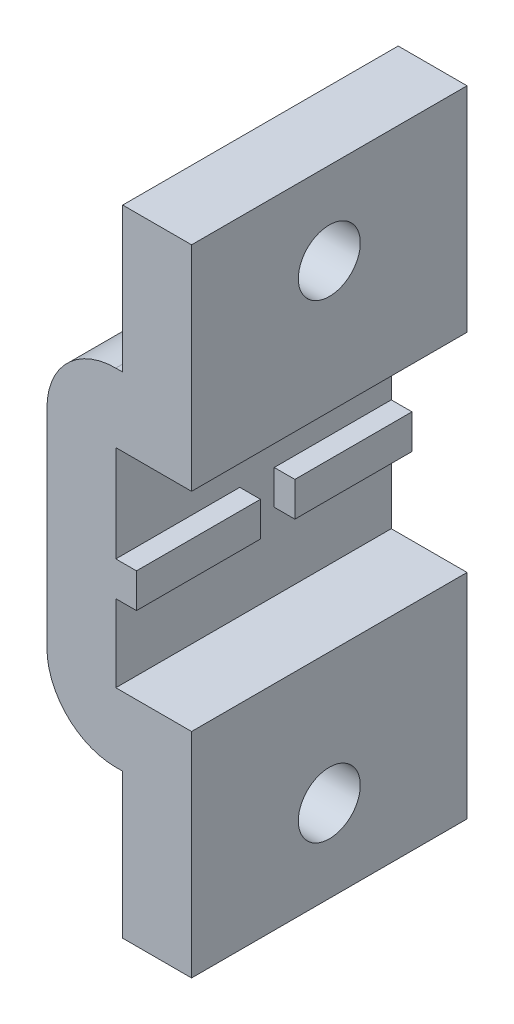
ISO-10303-21;
HEADER;
FILE_DESCRIPTION(('STEP AP214'),'2;1');
FILE_NAME('part.step','',(''),(''),'','','');
FILE_SCHEMA(('AUTOMOTIVE_DESIGN { 1 0 10303 214 1 1 1 1 }'));
ENDSEC;
DATA;
#1=APPLICATION_CONTEXT('core data for automotive mechanical design processes');
#2=APPLICATION_PROTOCOL_DEFINITION('international standard','automotive_design',2000,#1);
#3=PRODUCT_CONTEXT('',#1,'mechanical');
#4=PRODUCT('Part','Part','',(#3));
#5=PRODUCT_RELATED_PRODUCT_CATEGORY('part','',(#4));
#6=PRODUCT_DEFINITION_FORMATION('','',#4);
#7=PRODUCT_DEFINITION_CONTEXT('part definition',#1,'design');
#8=PRODUCT_DEFINITION('design','',#6,#7);
#9=PRODUCT_DEFINITION_SHAPE('','',#8);
#10=(LENGTH_UNIT() NAMED_UNIT(*) SI_UNIT(.MILLI.,.METRE.));
#11=(NAMED_UNIT(*) PLANE_ANGLE_UNIT() SI_UNIT($,.RADIAN.));
#12=(NAMED_UNIT(*) SI_UNIT($,.STERADIAN.) SOLID_ANGLE_UNIT());
#13=UNCERTAINTY_MEASURE_WITH_UNIT(LENGTH_MEASURE(1.E-05),#10,'distance_accuracy_value','');
#14=(GEOMETRIC_REPRESENTATION_CONTEXT(3) GLOBAL_UNCERTAINTY_ASSIGNED_CONTEXT((#13)) GLOBAL_UNIT_ASSIGNED_CONTEXT((#10,
#11,#12)) REPRESENTATION_CONTEXT('',''));
#15=CARTESIAN_POINT('',(0.,0.,0.));
#16=DIRECTION('',(0.,0.,1.));
#17=DIRECTION('',(1.,0.,0.));
#18=AXIS2_PLACEMENT_3D('',#15,#16,#17);
#19=CARTESIAN_POINT('',(-5.5,0.,20.));
#20=DIRECTION('',(-1.,0.,0.));
#21=DIRECTION('',(0.,0.,1.));
#22=AXIS2_PLACEMENT_3D('',#19,#20,#21);
#23=PLANE('',#22);
#24=DIRECTION('',(0.,0.,-1.));
#25=VECTOR('',#24,1.);
#26=CARTESIAN_POINT('',(-5.5,5.6,20.));
#27=LINE('',#26,#25);
#28=CARTESIAN_POINT('',(-5.5,5.6,20.));
#29=VERTEX_POINT('',#28);
#30=CARTESIAN_POINT('',(-5.5,5.6,11.));
#31=VERTEX_POINT('',#30);
#32=EDGE_CURVE('E257',#29,#31,#27,.T.);
#33=ORIENTED_EDGE('',*,*,#32,.F.);
#34=DIRECTION('',(0.,1.,0.));
#35=VECTOR('',#34,1.);
#36=CARTESIAN_POINT('',(-5.5,0.,20.));
#37=LINE('',#36,#35);
#38=CARTESIAN_POINT('',(-5.5,0.,20.));
#39=VERTEX_POINT('',#38);
#40=EDGE_CURVE('E219',#39,#29,#37,.T.);
#41=ORIENTED_EDGE('',*,*,#40,.F.);
#42=DIRECTION('',(0.,0.,-1.));
#43=VECTOR('',#42,1.);
#44=CARTESIAN_POINT('',(-5.5,0.,20.));
#45=LINE('',#44,#43);
#46=CARTESIAN_POINT('',(-5.5,0.,0.));
#47=VERTEX_POINT('',#46);
#48=EDGE_CURVE('E370',#39,#47,#45,.T.);
#49=ORIENTED_EDGE('',*,*,#48,.T.);
#50=DIRECTION('',(0.,1.,0.));
#51=VECTOR('',#50,1.);
#52=CARTESIAN_POINT('',(-5.5,0.,0.));
#53=LINE('',#52,#51);
#54=CARTESIAN_POINT('',(-5.5,5.6,0.));
#55=VERTEX_POINT('',#54);
#56=EDGE_CURVE('E351',#47,#55,#53,.T.);
#57=ORIENTED_EDGE('',*,*,#56,.T.);
#58=DIRECTION('',(0.,0.,-1.));
#59=VECTOR('',#58,1.);
#60=CARTESIAN_POINT('',(-5.5,5.6,0.));
#61=LINE('',#60,#59);
#62=CARTESIAN_POINT('',(-5.5,5.6,8.5));
#63=VERTEX_POINT('',#62);
#64=EDGE_CURVE('E66',#63,#55,#61,.T.);
#65=ORIENTED_EDGE('',*,*,#64,.F.);
#66=DIRECTION('',(0.,-1.,0.));
#67=VECTOR('',#66,1.);
#68=CARTESIAN_POINT('',(-5.5,5.6,8.5));
#69=LINE('',#68,#67);
#70=CARTESIAN_POINT('',(-5.5,8.1,8.5));
#71=VERTEX_POINT('',#70);
#72=EDGE_CURVE('E61',#71,#63,#69,.T.);
#73=ORIENTED_EDGE('',*,*,#72,.F.);
#74=DIRECTION('',(0.,0.,1.));
#75=VECTOR('',#74,1.);
#76=CARTESIAN_POINT('',(-5.5,8.1,0.));
#77=LINE('',#76,#75);
#78=CARTESIAN_POINT('',(-5.5,8.1,0.));
#79=VERTEX_POINT('',#78);
#80=EDGE_CURVE('E254',#79,#71,#77,.T.);
#81=ORIENTED_EDGE('',*,*,#80,.F.);
#82=CARTESIAN_POINT('',(-5.5,15.1,0.));
#83=VERTEX_POINT('',#82);
#84=EDGE_CURVE('E350',#79,#83,#53,.T.);
#85=ORIENTED_EDGE('',*,*,#84,.T.);
#86=DIRECTION('',(0.,0.,-1.));
#87=VECTOR('',#86,1.);
#88=CARTESIAN_POINT('',(-5.5,15.1,20.));
#89=LINE('',#88,#87);
#90=CARTESIAN_POINT('',(-5.5,15.1,20.));
#91=VERTEX_POINT('',#90);
#92=EDGE_CURVE('E366',#91,#83,#89,.T.);
#93=ORIENTED_EDGE('',*,*,#92,.F.);
#94=CARTESIAN_POINT('',(-5.5,8.1,20.));
#95=VERTEX_POINT('',#94);
#96=EDGE_CURVE('E311',#95,#91,#37,.T.);
#97=ORIENTED_EDGE('',*,*,#96,.F.);
#98=DIRECTION('',(0.,0.,1.));
#99=VECTOR('',#98,1.);
#100=CARTESIAN_POINT('',(-5.5,8.1,20.));
#101=LINE('',#100,#99);
#102=CARTESIAN_POINT('',(-5.5,8.1,11.));
#103=VERTEX_POINT('',#102);
#104=EDGE_CURVE('E213',#103,#95,#101,.T.);
#105=ORIENTED_EDGE('',*,*,#104,.F.);
#106=DIRECTION('',(0.,1.,0.));
#107=VECTOR('',#106,1.);
#108=CARTESIAN_POINT('',(-5.5,5.6,11.));
#109=LINE('',#108,#107);
#110=EDGE_CURVE('E696',#31,#103,#109,.T.);
#111=ORIENTED_EDGE('',*,*,#110,.F.);
#112=EDGE_LOOP('',(#33,#41,#49,#57,#65,#73,#81,#85,#93,#97,#105,#111));
#113=FACE_BOUND('',#112,.T.);
#114=ADVANCED_FACE('F45',(#113),#23,.F.);
#115=CARTESIAN_POINT('',(-5.,30.6,20.));
#116=DIRECTION('',(1.,0.,0.));
#117=DIRECTION('',(0.,1.,0.));
#118=AXIS2_PLACEMENT_3D('',#115,#116,#117);
#119=PLANE('',#118);
#120=DIRECTION('',(0.,-1.,0.));
#121=VECTOR('',#120,1.);
#122=CARTESIAN_POINT('',(-5.,30.6,0.));
#123=LINE('',#122,#121);
#124=CARTESIAN_POINT('',(-5.,30.6,0.));
#125=VERTEX_POINT('',#124);
#126=CARTESIAN_POINT('',(-5.,20.1,0.));
#127=VERTEX_POINT('',#126);
#128=EDGE_CURVE('E324',#125,#127,#123,.T.);
#129=ORIENTED_EDGE('',*,*,#128,.T.);
#130=DIRECTION('',(0.,0.,-1.));
#131=VECTOR('',#130,1.);
#132=CARTESIAN_POINT('',(-5.,20.1,20.));
#133=LINE('',#132,#131);
#134=CARTESIAN_POINT('',(-5.,20.1,20.));
#135=VERTEX_POINT('',#134);
#136=EDGE_CURVE('E390',#135,#127,#133,.T.);
#137=ORIENTED_EDGE('',*,*,#136,.F.);
#138=DIRECTION('',(0.,-1.,0.));
#139=VECTOR('',#138,1.);
#140=CARTESIAN_POINT('',(-5.,30.6,20.));
#141=LINE('',#140,#139);
#142=CARTESIAN_POINT('',(-5.,30.6,20.));
#143=VERTEX_POINT('',#142);
#144=EDGE_CURVE('E285',#143,#135,#141,.T.);
#145=ORIENTED_EDGE('',*,*,#144,.F.);
#146=DIRECTION('',(0.,0.,-1.));
#147=VECTOR('',#146,1.);
#148=CARTESIAN_POINT('',(-5.,30.6,20.));
#149=LINE('',#148,#147);
#150=EDGE_CURVE('E394',#143,#125,#149,.T.);
#151=ORIENTED_EDGE('',*,*,#150,.T.);
#152=EDGE_LOOP('',(#129,#137,#145,#151));
#153=FACE_BOUND('',#152,.T.);
#154=CARTESIAN_POINT('',(-5.,24.6,10.));
#155=DIRECTION('',(-1.,0.,0.));
#156=DIRECTION('',(0.,0.,1.));
#157=AXIS2_PLACEMENT_3D('',#154,#155,#156);
#158=CIRCLE('',#157,2.25);
#159=CARTESIAN_POINT('',(-5.,24.6,12.25));
#160=VERTEX_POINT('',#159);
#161=EDGE_CURVE('E221',#160,#160,#158,.T.);
#162=ORIENTED_EDGE('',*,*,#161,.F.);
#163=EDGE_LOOP('',(#162));
#164=FACE_BOUND('',#163,.T.);
#165=ADVANCED_FACE('F446',(#153,#164),#119,.F.);
#166=CARTESIAN_POINT('',(-5.,-5.,20.));
#167=DIRECTION('',(1.,0.,0.));
#168=DIRECTION('',(0.,1.,0.));
#169=AXIS2_PLACEMENT_3D('',#166,#167,#168);
#170=PLANE('',#169);
#171=DIRECTION('',(0.,-1.,0.));
#172=VECTOR('',#171,1.);
#173=CARTESIAN_POINT('',(-5.,-5.,0.));
#174=LINE('',#173,#172);
#175=CARTESIAN_POINT('',(-5.,-5.,0.));
#176=VERTEX_POINT('',#175);
#177=CARTESIAN_POINT('',(-5.,-15.5,0.));
#178=VERTEX_POINT('',#177);
#179=EDGE_CURVE('E338',#176,#178,#174,.T.);
#180=ORIENTED_EDGE('',*,*,#179,.T.);
#181=DIRECTION('',(0.,0.,-1.));
#182=VECTOR('',#181,1.);
#183=CARTESIAN_POINT('',(-5.,-15.5,20.));
#184=LINE('',#183,#182);
#185=CARTESIAN_POINT('',(-5.,-15.5,20.));
#186=VERTEX_POINT('',#185);
#187=EDGE_CURVE('E382',#186,#178,#184,.T.);
#188=ORIENTED_EDGE('',*,*,#187,.F.);
#189=DIRECTION('',(0.,-1.,0.));
#190=VECTOR('',#189,1.);
#191=CARTESIAN_POINT('',(-5.,-5.,20.));
#192=LINE('',#191,#190);
#193=CARTESIAN_POINT('',(-5.,-5.,20.));
#194=VERTEX_POINT('',#193);
#195=EDGE_CURVE('E299',#194,#186,#192,.T.);
#196=ORIENTED_EDGE('',*,*,#195,.F.);
#197=DIRECTION('',(0.,0.,-1.));
#198=VECTOR('',#197,1.);
#199=CARTESIAN_POINT('',(-5.,-5.,20.));
#200=LINE('',#199,#198);
#201=EDGE_CURVE('E386',#194,#176,#200,.T.);
#202=ORIENTED_EDGE('',*,*,#201,.T.);
#203=EDGE_LOOP('',(#180,#188,#196,#202));
#204=FACE_BOUND('',#203,.T.);
#205=CARTESIAN_POINT('',(-5.,-9.5,10.));
#206=DIRECTION('',(-1.,0.,0.));
#207=DIRECTION('',(0.,0.,1.));
#208=AXIS2_PLACEMENT_3D('',#205,#206,#207);
#209=CIRCLE('',#208,2.25);
#210=CARTESIAN_POINT('',(-5.,-9.5,12.25));
#211=VERTEX_POINT('',#210);
#212=EDGE_CURVE('E272',#211,#211,#209,.T.);
#213=ORIENTED_EDGE('',*,*,#212,.F.);
#214=EDGE_LOOP('',(#213));
#215=FACE_BOUND('',#214,.T.);
#216=ADVANCED_FACE('F497',(#204,#215),#170,.F.);
#217=CARTESIAN_POINT('',(0.,30.6,20.));
#218=DIRECTION('',(0.,-1.,0.));
#219=DIRECTION('',(0.,0.,-1.));
#220=AXIS2_PLACEMENT_3D('',#217,#218,#219);
#221=PLANE('',#220);
#222=DIRECTION('',(-1.,0.,0.));
#223=VECTOR('',#222,1.);
#224=CARTESIAN_POINT('',(0.,30.6,0.));
#225=LINE('',#224,#223);
#226=CARTESIAN_POINT('',(0.,30.6,0.));
#227=VERTEX_POINT('',#226);
#228=EDGE_CURVE('E280',#227,#125,#225,.T.);
#229=ORIENTED_EDGE('',*,*,#228,.T.);
#230=ORIENTED_EDGE('',*,*,#150,.F.);
#231=DIRECTION('',(-1.,0.,0.));
#232=VECTOR('',#231,1.);
#233=CARTESIAN_POINT('',(0.,30.6,20.));
#234=LINE('',#233,#232);
#235=CARTESIAN_POINT('',(0.,30.6,20.));
#236=VERTEX_POINT('',#235);
#237=EDGE_CURVE('E281',#236,#143,#234,.T.);
#238=ORIENTED_EDGE('',*,*,#237,.F.);
#239=DIRECTION('',(0.,0.,-1.));
#240=VECTOR('',#239,1.);
#241=CARTESIAN_POINT('',(0.,30.6,20.));
#242=LINE('',#241,#240);
#243=EDGE_CURVE('E320',#236,#227,#242,.T.);
#244=ORIENTED_EDGE('',*,*,#243,.T.);
#245=EDGE_LOOP('',(#229,#230,#238,#244));
#246=FACE_BOUND('',#245,.T.);
#247=ADVANCED_FACE('F453',(#246),#221,.F.);
#248=CARTESIAN_POINT('',(-5.,20.1,20.));
#249=DIRECTION('',(0.,-1.,0.));
#250=DIRECTION('',(0.,0.,-1.));
#251=AXIS2_PLACEMENT_3D('',#248,#249,#250);
#252=PLANE('',#251);
#253=DIRECTION('',(-1.,0.,0.));
#254=VECTOR('',#253,1.);
#255=CARTESIAN_POINT('',(-5.,20.1,0.));
#256=LINE('',#255,#254);
#257=CARTESIAN_POINT('',(-5.5,20.1,0.));
#258=VERTEX_POINT('',#257);
#259=EDGE_CURVE('E327',#127,#258,#256,.T.);
#260=ORIENTED_EDGE('',*,*,#259,.T.);
#261=DIRECTION('',(0.,0.,-1.));
#262=VECTOR('',#261,1.);
#263=CARTESIAN_POINT('',(-5.5,20.1,20.));
#264=LINE('',#263,#262);
#265=CARTESIAN_POINT('',(-5.5,20.1,20.));
#266=VERTEX_POINT('',#265);
#267=EDGE_CURVE('E11',#258,#266,#264,.F.);
#268=ORIENTED_EDGE('',*,*,#267,.T.);
#269=DIRECTION('',(-1.,0.,0.));
#270=VECTOR('',#269,1.);
#271=CARTESIAN_POINT('',(-5.,20.1,20.));
#272=LINE('',#271,#270);
#273=EDGE_CURVE('E289',#135,#266,#272,.T.);
#274=ORIENTED_EDGE('',*,*,#273,.F.);
#275=ORIENTED_EDGE('',*,*,#136,.T.);
#276=EDGE_LOOP('',(#260,#268,#274,#275));
#277=FACE_BOUND('',#276,.T.);
#278=ADVANCED_FACE('F442',(#277),#252,.F.);
#279=CARTESIAN_POINT('',(-10.5,20.1,20.));
#280=DIRECTION('',(1.,0.,0.));
#281=DIRECTION('',(0.,1.,0.));
#282=AXIS2_PLACEMENT_3D('',#279,#280,#281);
#283=PLANE('',#282);
#284=DIRECTION('',(0.,-1.,0.));
#285=VECTOR('',#284,1.);
#286=CARTESIAN_POINT('',(-10.5,20.1,0.));
#287=LINE('',#286,#285);
#288=CARTESIAN_POINT('',(-10.5,15.1,0.));
#289=VERTEX_POINT('',#288);
#290=CARTESIAN_POINT('',(-10.5,0.,0.));
#291=VERTEX_POINT('',#290);
#292=EDGE_CURVE('E331',#289,#291,#287,.T.);
#293=ORIENTED_EDGE('',*,*,#292,.T.);
#294=DIRECTION('',(0.,0.,-1.));
#295=VECTOR('',#294,1.);
#296=CARTESIAN_POINT('',(-10.5,0.,20.));
#297=LINE('',#296,#295);
#298=CARTESIAN_POINT('',(-10.5,0.,20.));
#299=VERTEX_POINT('',#298);
#300=EDGE_CURVE('E412',#291,#299,#297,.F.);
#301=ORIENTED_EDGE('',*,*,#300,.T.);
#302=DIRECTION('',(0.,-1.,0.));
#303=VECTOR('',#302,1.);
#304=CARTESIAN_POINT('',(-10.5,20.1,20.));
#305=LINE('',#304,#303);
#306=CARTESIAN_POINT('',(-10.5,15.1,20.));
#307=VERTEX_POINT('',#306);
#308=EDGE_CURVE('E293',#307,#299,#305,.T.);
#309=ORIENTED_EDGE('',*,*,#308,.F.);
#310=DIRECTION('',(0.,0.,-1.));
#311=VECTOR('',#310,1.);
#312=CARTESIAN_POINT('',(-10.5,15.1,20.));
#313=LINE('',#312,#311);
#314=EDGE_CURVE('E408',#307,#289,#313,.T.);
#315=ORIENTED_EDGE('',*,*,#314,.T.);
#316=EDGE_LOOP('',(#293,#301,#309,#315));
#317=FACE_BOUND('',#316,.T.);
#318=ADVANCED_FACE('F435',(#317),#283,.F.);
#319=CARTESIAN_POINT('',(-10.5,-5.,20.));
#320=DIRECTION('',(0.,1.,0.));
#321=DIRECTION('',(0.,0.,1.));
#322=AXIS2_PLACEMENT_3D('',#319,#320,#321);
#323=PLANE('',#322);
#324=DIRECTION('',(1.,0.,0.));
#325=VECTOR('',#324,1.);
#326=CARTESIAN_POINT('',(-10.5,-5.,20.));
#327=LINE('',#326,#325);
#328=CARTESIAN_POINT('',(-5.5,-5.,20.));
#329=VERTEX_POINT('',#328);
#330=EDGE_CURVE('E296',#329,#194,#327,.T.);
#331=ORIENTED_EDGE('',*,*,#330,.F.);
#332=DIRECTION('',(0.,0.,-1.));
#333=VECTOR('',#332,1.);
#334=CARTESIAN_POINT('',(-5.5,-5.,20.));
#335=LINE('',#334,#333);
#336=CARTESIAN_POINT('',(-5.5,-5.,0.));
#337=VERTEX_POINT('',#336);
#338=EDGE_CURVE('E398',#329,#337,#335,.T.);
#339=ORIENTED_EDGE('',*,*,#338,.T.);
#340=DIRECTION('',(1.,0.,0.));
#341=VECTOR('',#340,1.);
#342=CARTESIAN_POINT('',(-10.5,-5.,0.));
#343=LINE('',#342,#341);
#344=EDGE_CURVE('E335',#337,#176,#343,.T.);
#345=ORIENTED_EDGE('',*,*,#344,.T.);
#346=ORIENTED_EDGE('',*,*,#201,.F.);
#347=EDGE_LOOP('',(#331,#339,#345,#346));
#348=FACE_BOUND('',#347,.T.);
#349=ADVANCED_FACE('F426',(#348),#323,.F.);
#350=CARTESIAN_POINT('',(-5.,-15.5,20.));
#351=DIRECTION('',(0.,1.,0.));
#352=DIRECTION('',(0.,0.,1.));
#353=AXIS2_PLACEMENT_3D('',#350,#351,#352);
#354=PLANE('',#353);
#355=DIRECTION('',(1.,0.,0.));
#356=VECTOR('',#355,1.);
#357=CARTESIAN_POINT('',(-5.,-15.5,0.));
#358=LINE('',#357,#356);
#359=CARTESIAN_POINT('',(0.,-15.5,0.));
#360=VERTEX_POINT('',#359);
#361=EDGE_CURVE('E341',#178,#360,#358,.T.);
#362=ORIENTED_EDGE('',*,*,#361,.T.);
#363=DIRECTION('',(0.,0.,-1.));
#364=VECTOR('',#363,1.);
#365=CARTESIAN_POINT('',(0.,-15.5,20.));
#366=LINE('',#365,#364);
#367=CARTESIAN_POINT('',(0.,-15.5,20.));
#368=VERTEX_POINT('',#367);
#369=EDGE_CURVE('E378',#368,#360,#366,.T.);
#370=ORIENTED_EDGE('',*,*,#369,.F.);
#371=DIRECTION('',(1.,0.,0.));
#372=VECTOR('',#371,1.);
#373=CARTESIAN_POINT('',(-5.,-15.5,20.));
#374=LINE('',#373,#372);
#375=EDGE_CURVE('E302',#186,#368,#374,.T.);
#376=ORIENTED_EDGE('',*,*,#375,.F.);
#377=ORIENTED_EDGE('',*,*,#187,.T.);
#378=EDGE_LOOP('',(#362,#370,#376,#377));
#379=FACE_BOUND('',#378,.T.);
#380=ADVANCED_FACE('F509',(#379),#354,.F.);
#381=CARTESIAN_POINT('',(0.,-15.5,20.));
#382=DIRECTION('',(-1.,0.,0.));
#383=DIRECTION('',(0.,0.,1.));
#384=AXIS2_PLACEMENT_3D('',#381,#382,#383);
#385=PLANE('',#384);
#386=CARTESIAN_POINT('',(0.,-9.5,10.));
#387=DIRECTION('',(-1.,0.,0.));
#388=DIRECTION('',(0.,0.,1.));
#389=AXIS2_PLACEMENT_3D('',#386,#387,#388);
#390=CIRCLE('',#389,2.25);
#391=CARTESIAN_POINT('',(0.,-9.5,12.25));
#392=VERTEX_POINT('',#391);
#393=EDGE_CURVE('E276',#392,#392,#390,.T.);
#394=ORIENTED_EDGE('',*,*,#393,.T.);
#395=EDGE_LOOP('',(#394));
#396=FACE_BOUND('',#395,.T.);
#397=DIRECTION('',(0.,1.,0.));
#398=VECTOR('',#397,1.);
#399=CARTESIAN_POINT('',(0.,-15.5,0.));
#400=LINE('',#399,#398);
#401=CARTESIAN_POINT('',(0.,0.,0.));
#402=VERTEX_POINT('',#401);
#403=EDGE_CURVE('E344',#360,#402,#400,.T.);
#404=ORIENTED_EDGE('',*,*,#403,.T.);
#405=DIRECTION('',(0.,0.,-1.));
#406=VECTOR('',#405,1.);
#407=CARTESIAN_POINT('',(0.,0.,20.));
#408=LINE('',#407,#406);
#409=CARTESIAN_POINT('',(0.,0.,20.));
#410=VERTEX_POINT('',#409);
#411=EDGE_CURVE('E374',#410,#402,#408,.T.);
#412=ORIENTED_EDGE('',*,*,#411,.F.);
#413=DIRECTION('',(0.,1.,0.));
#414=VECTOR('',#413,1.);
#415=CARTESIAN_POINT('',(0.,-15.5,20.));
#416=LINE('',#415,#414);
#417=EDGE_CURVE('E305',#368,#410,#416,.T.);
#418=ORIENTED_EDGE('',*,*,#417,.F.);
#419=ORIENTED_EDGE('',*,*,#369,.T.);
#420=EDGE_LOOP('',(#404,#412,#418,#419));
#421=FACE_BOUND('',#420,.T.);
#422=ADVANCED_FACE('F505',(#396,#421),#385,.F.);
#423=CARTESIAN_POINT('',(0.,0.,20.));
#424=DIRECTION('',(0.,-1.,0.));
#425=DIRECTION('',(1.,0.,0.));
#426=AXIS2_PLACEMENT_3D('',#423,#424,#425);
#427=PLANE('',#426);
#428=DIRECTION('',(-1.,0.,0.));
#429=VECTOR('',#428,1.);
#430=CARTESIAN_POINT('',(0.,0.,0.));
#431=LINE('',#430,#429);
#432=EDGE_CURVE('E347',#402,#47,#431,.T.);
#433=ORIENTED_EDGE('',*,*,#432,.T.);
#434=ORIENTED_EDGE('',*,*,#48,.F.);
#435=DIRECTION('',(-1.,0.,0.));
#436=VECTOR('',#435,1.);
#437=CARTESIAN_POINT('',(0.,0.,20.));
#438=LINE('',#437,#436);
#439=EDGE_CURVE('E308',#410,#39,#438,.T.);
#440=ORIENTED_EDGE('',*,*,#439,.F.);
#441=ORIENTED_EDGE('',*,*,#411,.T.);
#442=EDGE_LOOP('',(#433,#434,#440,#441));
#443=FACE_BOUND('',#442,.T.);
#444=ADVANCED_FACE('F502',(#443),#427,.F.);
#445=CARTESIAN_POINT('',(-5.5,15.1,20.));
#446=DIRECTION('',(0.,1.,0.));
#447=DIRECTION('',(0.,0.,1.));
#448=AXIS2_PLACEMENT_3D('',#445,#446,#447);
#449=PLANE('',#448);
#450=DIRECTION('',(1.,0.,0.));
#451=VECTOR('',#450,1.);
#452=CARTESIAN_POINT('',(-5.5,15.1,0.));
#453=LINE('',#452,#451);
#454=CARTESIAN_POINT('',(0.,15.1,0.));
#455=VERTEX_POINT('',#454);
#456=EDGE_CURVE('E354',#83,#455,#453,.T.);
#457=ORIENTED_EDGE('',*,*,#456,.T.);
#458=DIRECTION('',(0.,0.,-1.));
#459=VECTOR('',#458,1.);
#460=CARTESIAN_POINT('',(0.,15.1,20.));
#461=LINE('',#460,#459);
#462=CARTESIAN_POINT('',(0.,15.1,20.));
#463=VERTEX_POINT('',#462);
#464=EDGE_CURVE('E362',#463,#455,#461,.T.);
#465=ORIENTED_EDGE('',*,*,#464,.F.);
#466=DIRECTION('',(1.,0.,0.));
#467=VECTOR('',#466,1.);
#468=CARTESIAN_POINT('',(-5.5,15.1,20.));
#469=LINE('',#468,#467);
#470=EDGE_CURVE('E314',#91,#463,#469,.T.);
#471=ORIENTED_EDGE('',*,*,#470,.F.);
#472=ORIENTED_EDGE('',*,*,#92,.T.);
#473=EDGE_LOOP('',(#457,#465,#471,#472));
#474=FACE_BOUND('',#473,.T.);
#475=ADVANCED_FACE('F462',(#474),#449,.F.);
#476=CARTESIAN_POINT('',(0.,15.1,20.));
#477=DIRECTION('',(-1.,0.,0.));
#478=DIRECTION('',(0.,0.,1.));
#479=AXIS2_PLACEMENT_3D('',#476,#477,#478);
#480=PLANE('',#479);
#481=CARTESIAN_POINT('',(0.,24.6,10.));
#482=DIRECTION('',(-1.,0.,0.));
#483=DIRECTION('',(0.,0.,1.));
#484=AXIS2_PLACEMENT_3D('',#481,#482,#483);
#485=CIRCLE('',#484,2.25);
#486=CARTESIAN_POINT('',(0.,24.6,12.25));
#487=VERTEX_POINT('',#486);
#488=EDGE_CURVE('E226',#487,#487,#485,.T.);
#489=ORIENTED_EDGE('',*,*,#488,.T.);
#490=EDGE_LOOP('',(#489));
#491=FACE_BOUND('',#490,.T.);
#492=DIRECTION('',(0.,1.,0.));
#493=VECTOR('',#492,1.);
#494=CARTESIAN_POINT('',(0.,15.1,0.));
#495=LINE('',#494,#493);
#496=EDGE_CURVE('E286',#455,#227,#495,.T.);
#497=ORIENTED_EDGE('',*,*,#496,.T.);
#498=ORIENTED_EDGE('',*,*,#243,.F.);
#499=DIRECTION('',(0.,1.,0.));
#500=VECTOR('',#499,1.);
#501=CARTESIAN_POINT('',(0.,15.1,20.));
#502=LINE('',#501,#500);
#503=EDGE_CURVE('E317',#463,#236,#502,.T.);
#504=ORIENTED_EDGE('',*,*,#503,.F.);
#505=ORIENTED_EDGE('',*,*,#464,.T.);
#506=EDGE_LOOP('',(#497,#498,#504,#505));
#507=FACE_BOUND('',#506,.T.);
#508=ADVANCED_FACE('F458',(#491,#507),#480,.F.);
#509=CARTESIAN_POINT('',(0.,0.,20.));
#510=DIRECTION('',(0.,0.,1.));
#511=DIRECTION('',(1.,0.,0.));
#512=AXIS2_PLACEMENT_3D('',#509,#510,#511);
#513=PLANE('',#512);
#514=ORIENTED_EDGE('',*,*,#308,.T.);
#515=CARTESIAN_POINT('',(-5.5,0.,20.));
#516=DIRECTION('',(0.,0.,1.));
#517=DIRECTION('',(1.,0.,0.));
#518=AXIS2_PLACEMENT_3D('',#515,#516,#517);
#519=CIRCLE('',#518,5.);
#520=EDGE_CURVE('E54',#299,#329,#519,.T.);
#521=ORIENTED_EDGE('',*,*,#520,.T.);
#522=ORIENTED_EDGE('',*,*,#330,.T.);
#523=ORIENTED_EDGE('',*,*,#195,.T.);
#524=ORIENTED_EDGE('',*,*,#375,.T.);
#525=ORIENTED_EDGE('',*,*,#417,.T.);
#526=ORIENTED_EDGE('',*,*,#439,.T.);
#527=ORIENTED_EDGE('',*,*,#40,.T.);
#528=DIRECTION('',(-1.,0.,0.));
#529=VECTOR('',#528,1.);
#530=CARTESIAN_POINT('',(-4.,5.6,20.));
#531=LINE('',#530,#529);
#532=CARTESIAN_POINT('',(-4.,5.6,20.));
#533=VERTEX_POINT('',#532);
#534=EDGE_CURVE('E196',#533,#29,#531,.T.);
#535=ORIENTED_EDGE('',*,*,#534,.F.);
#536=DIRECTION('',(0.,-1.,0.));
#537=VECTOR('',#536,1.);
#538=CARTESIAN_POINT('',(-4.,5.6,20.));
#539=LINE('',#538,#537);
#540=CARTESIAN_POINT('',(-4.,8.1,20.));
#541=VERTEX_POINT('',#540);
#542=EDGE_CURVE('E204',#541,#533,#539,.T.);
#543=ORIENTED_EDGE('',*,*,#542,.F.);
#544=DIRECTION('',(-1.,0.,0.));
#545=VECTOR('',#544,1.);
#546=CARTESIAN_POINT('',(-4.,8.1,20.));
#547=LINE('',#546,#545);
#548=EDGE_CURVE('E692',#541,#95,#547,.T.);
#549=ORIENTED_EDGE('',*,*,#548,.T.);
#550=ORIENTED_EDGE('',*,*,#96,.T.);
#551=ORIENTED_EDGE('',*,*,#470,.T.);
#552=ORIENTED_EDGE('',*,*,#503,.T.);
#553=ORIENTED_EDGE('',*,*,#237,.T.);
#554=ORIENTED_EDGE('',*,*,#144,.T.);
#555=ORIENTED_EDGE('',*,*,#273,.T.);
#556=CARTESIAN_POINT('',(-5.5,15.1,20.));
#557=DIRECTION('',(0.,0.,1.));
#558=DIRECTION('',(1.,0.,0.));
#559=AXIS2_PLACEMENT_3D('',#556,#557,#558);
#560=CIRCLE('',#559,5.);
#561=EDGE_CURVE('E415',#266,#307,#560,.T.);
#562=ORIENTED_EDGE('',*,*,#561,.T.);
#563=EDGE_LOOP('',(#514,#521,#522,#523,#524,#525,#526,#527,#535,#543,#549,#550,#551,#552,#553,
#554,#555,#562));
#564=FACE_BOUND('',#563,.T.);
#565=ADVANCED_FACE('F217',(#564),#513,.T.);
#566=CARTESIAN_POINT('',(0.,0.,0.));
#567=DIRECTION('',(0.,0.,1.));
#568=DIRECTION('',(1.,0.,0.));
#569=AXIS2_PLACEMENT_3D('',#566,#567,#568);
#570=PLANE('',#569);
#571=ORIENTED_EDGE('',*,*,#344,.F.);
#572=CARTESIAN_POINT('',(-5.5,0.,0.));
#573=DIRECTION('',(0.,0.,1.));
#574=DIRECTION('',(1.,0.,0.));
#575=AXIS2_PLACEMENT_3D('',#572,#573,#574);
#576=CIRCLE('',#575,5.);
#577=EDGE_CURVE('E405',#337,#291,#576,.F.);
#578=ORIENTED_EDGE('',*,*,#577,.T.);
#579=ORIENTED_EDGE('',*,*,#292,.F.);
#580=CARTESIAN_POINT('',(-5.5,15.1,0.));
#581=DIRECTION('',(0.,0.,1.));
#582=DIRECTION('',(1.,0.,0.));
#583=AXIS2_PLACEMENT_3D('',#580,#581,#582);
#584=CIRCLE('',#583,5.);
#585=EDGE_CURVE('E402',#289,#258,#584,.F.);
#586=ORIENTED_EDGE('',*,*,#585,.T.);
#587=ORIENTED_EDGE('',*,*,#259,.F.);
#588=ORIENTED_EDGE('',*,*,#128,.F.);
#589=ORIENTED_EDGE('',*,*,#228,.F.);
#590=ORIENTED_EDGE('',*,*,#496,.F.);
#591=ORIENTED_EDGE('',*,*,#456,.F.);
#592=ORIENTED_EDGE('',*,*,#84,.F.);
#593=DIRECTION('',(-1.,0.,0.));
#594=VECTOR('',#593,1.);
#595=CARTESIAN_POINT('',(-4.,8.1,0.));
#596=LINE('',#595,#594);
#597=CARTESIAN_POINT('',(-4.,8.1,0.));
#598=VERTEX_POINT('',#597);
#599=EDGE_CURVE('E232',#598,#79,#596,.T.);
#600=ORIENTED_EDGE('',*,*,#599,.F.);
#601=DIRECTION('',(0.,1.,0.));
#602=VECTOR('',#601,1.);
#603=CARTESIAN_POINT('',(-4.,5.6,0.));
#604=LINE('',#603,#602);
#605=CARTESIAN_POINT('',(-4.,5.6,0.));
#606=VERTEX_POINT('',#605);
#607=EDGE_CURVE('E251',#606,#598,#604,.T.);
#608=ORIENTED_EDGE('',*,*,#607,.F.);
#609=DIRECTION('',(-1.,0.,0.));
#610=VECTOR('',#609,1.);
#611=CARTESIAN_POINT('',(-4.,5.6,0.));
#612=LINE('',#611,#610);
#613=EDGE_CURVE('E244',#606,#55,#612,.T.);
#614=ORIENTED_EDGE('',*,*,#613,.T.);
#615=ORIENTED_EDGE('',*,*,#56,.F.);
#616=ORIENTED_EDGE('',*,*,#432,.F.);
#617=ORIENTED_EDGE('',*,*,#403,.F.);
#618=ORIENTED_EDGE('',*,*,#361,.F.);
#619=ORIENTED_EDGE('',*,*,#179,.F.);
#620=EDGE_LOOP('',(#571,#578,#579,#586,#587,#588,#589,#590,#591,#592,#600,#608,#614,#615,#616,
#617,#618,#619));
#621=FACE_BOUND('',#620,.T.);
#622=ADVANCED_FACE('F432',(#621),#570,.F.);
#623=CARTESIAN_POINT('',(-5.,-9.5,10.));
#624=DIRECTION('',(-1.,0.,0.));
#625=DIRECTION('',(0.,0.,1.));
#626=AXIS2_PLACEMENT_3D('',#623,#624,#625);
#627=CYLINDRICAL_SURFACE('',#626,2.25);
#628=ORIENTED_EDGE('',*,*,#393,.F.);
#629=EDGE_LOOP('',(#628));
#630=FACE_BOUND('',#629,.T.);
#631=ORIENTED_EDGE('',*,*,#212,.T.);
#632=EDGE_LOOP('',(#631));
#633=FACE_BOUND('',#632,.T.);
#634=ADVANCED_FACE('F529',(#630,#633),#627,.F.);
#635=CARTESIAN_POINT('',(-5.,24.6,10.));
#636=DIRECTION('',(-1.,0.,0.));
#637=DIRECTION('',(0.,0.,1.));
#638=AXIS2_PLACEMENT_3D('',#635,#636,#637);
#639=CYLINDRICAL_SURFACE('',#638,2.25);
#640=ORIENTED_EDGE('',*,*,#488,.F.);
#641=EDGE_LOOP('',(#640));
#642=FACE_BOUND('',#641,.T.);
#643=ORIENTED_EDGE('',*,*,#161,.T.);
#644=EDGE_LOOP('',(#643));
#645=FACE_BOUND('',#644,.T.);
#646=ADVANCED_FACE('F525',(#642,#645),#639,.F.);
#647=CARTESIAN_POINT('',(-5.5,0.,20.));
#648=DIRECTION('',(0.,0.,-1.));
#649=DIRECTION('',(-1.,0.,0.));
#650=AXIS2_PLACEMENT_3D('',#647,#648,#649);
#651=CYLINDRICAL_SURFACE('',#650,5.);
#652=ORIENTED_EDGE('',*,*,#520,.F.);
#653=ORIENTED_EDGE('',*,*,#300,.F.);
#654=ORIENTED_EDGE('',*,*,#577,.F.);
#655=ORIENTED_EDGE('',*,*,#338,.F.);
#656=EDGE_LOOP('',(#652,#653,#654,#655));
#657=FACE_BOUND('',#656,.T.);
#658=ADVANCED_FACE('F429',(#657),#651,.T.);
#659=CARTESIAN_POINT('',(-5.5,15.1,20.));
#660=DIRECTION('',(0.,0.,-1.));
#661=DIRECTION('',(-1.,0.,0.));
#662=AXIS2_PLACEMENT_3D('',#659,#660,#661);
#663=CYLINDRICAL_SURFACE('',#662,5.);
#664=ORIENTED_EDGE('',*,*,#561,.F.);
#665=ORIENTED_EDGE('',*,*,#267,.F.);
#666=ORIENTED_EDGE('',*,*,#585,.F.);
#667=ORIENTED_EDGE('',*,*,#314,.F.);
#668=EDGE_LOOP('',(#664,#665,#666,#667));
#669=FACE_BOUND('',#668,.T.);
#670=ADVANCED_FACE('F47',(#669),#663,.T.);
#671=CARTESIAN_POINT('',(-4.,8.1,0.));
#672=DIRECTION('',(0.,-1.,0.));
#673=DIRECTION('',(0.,0.,-1.));
#674=AXIS2_PLACEMENT_3D('',#671,#672,#673);
#675=PLANE('',#674);
#676=ORIENTED_EDGE('',*,*,#80,.T.);
#677=DIRECTION('',(-1.,0.,0.));
#678=VECTOR('',#677,1.);
#679=CARTESIAN_POINT('',(-4.,8.1,8.5));
#680=LINE('',#679,#678);
#681=CARTESIAN_POINT('',(-4.,8.1,8.5));
#682=VERTEX_POINT('',#681);
#683=EDGE_CURVE('E236',#682,#71,#680,.T.);
#684=ORIENTED_EDGE('',*,*,#683,.F.);
#685=DIRECTION('',(0.,0.,1.));
#686=VECTOR('',#685,1.);
#687=CARTESIAN_POINT('',(-4.,8.1,0.));
#688=LINE('',#687,#686);
#689=EDGE_CURVE('E263',#598,#682,#688,.T.);
#690=ORIENTED_EDGE('',*,*,#689,.F.);
#691=ORIENTED_EDGE('',*,*,#599,.T.);
#692=EDGE_LOOP('',(#676,#684,#690,#691));
#693=FACE_BOUND('',#692,.T.);
#694=ADVANCED_FACE('F469',(#693),#675,.F.);
#695=CARTESIAN_POINT('',(-4.,5.6,8.5));
#696=DIRECTION('',(0.,0.,-1.));
#697=DIRECTION('',(-1.,0.,0.));
#698=AXIS2_PLACEMENT_3D('',#695,#696,#697);
#699=PLANE('',#698);
#700=ORIENTED_EDGE('',*,*,#72,.T.);
#701=DIRECTION('',(-1.,0.,0.));
#702=VECTOR('',#701,1.);
#703=CARTESIAN_POINT('',(-4.,5.6,8.5));
#704=LINE('',#703,#702);
#705=CARTESIAN_POINT('',(-4.,5.6,8.5));
#706=VERTEX_POINT('',#705);
#707=EDGE_CURVE('E240',#706,#63,#704,.T.);
#708=ORIENTED_EDGE('',*,*,#707,.F.);
#709=DIRECTION('',(0.,-1.,0.));
#710=VECTOR('',#709,1.);
#711=CARTESIAN_POINT('',(-4.,5.6,8.5));
#712=LINE('',#711,#710);
#713=EDGE_CURVE('E260',#682,#706,#712,.T.);
#714=ORIENTED_EDGE('',*,*,#713,.F.);
#715=ORIENTED_EDGE('',*,*,#683,.T.);
#716=EDGE_LOOP('',(#700,#708,#714,#715));
#717=FACE_BOUND('',#716,.T.);
#718=ADVANCED_FACE('F481',(#717),#699,.F.);
#719=CARTESIAN_POINT('',(-4.,5.6,0.));
#720=DIRECTION('',(0.,1.,0.));
#721=DIRECTION('',(0.,0.,1.));
#722=AXIS2_PLACEMENT_3D('',#719,#720,#721);
#723=PLANE('',#722);
#724=ORIENTED_EDGE('',*,*,#64,.T.);
#725=ORIENTED_EDGE('',*,*,#613,.F.);
#726=DIRECTION('',(0.,0.,-1.));
#727=VECTOR('',#726,1.);
#728=CARTESIAN_POINT('',(-4.,5.6,0.));
#729=LINE('',#728,#727);
#730=EDGE_CURVE('E248',#706,#606,#729,.T.);
#731=ORIENTED_EDGE('',*,*,#730,.F.);
#732=ORIENTED_EDGE('',*,*,#707,.T.);
#733=EDGE_LOOP('',(#724,#725,#731,#732));
#734=FACE_BOUND('',#733,.T.);
#735=ADVANCED_FACE('F478',(#734),#723,.F.);
#736=CARTESIAN_POINT('',(-4.,0.,0.));
#737=DIRECTION('',(1.,0.,0.));
#738=DIRECTION('',(0.,0.,-1.));
#739=AXIS2_PLACEMENT_3D('',#736,#737,#738);
#740=PLANE('',#739);
#741=ORIENTED_EDGE('',*,*,#607,.T.);
#742=ORIENTED_EDGE('',*,*,#689,.T.);
#743=ORIENTED_EDGE('',*,*,#713,.T.);
#744=ORIENTED_EDGE('',*,*,#730,.T.);
#745=EDGE_LOOP('',(#741,#742,#743,#744));
#746=FACE_BOUND('',#745,.T.);
#747=ADVANCED_FACE('F472',(#746),#740,.T.);
#748=CARTESIAN_POINT('',(-4.,5.6,20.));
#749=DIRECTION('',(0.,1.,0.));
#750=DIRECTION('',(0.,0.,1.));
#751=AXIS2_PLACEMENT_3D('',#748,#749,#750);
#752=PLANE('',#751);
#753=ORIENTED_EDGE('',*,*,#32,.T.);
#754=DIRECTION('',(-1.,0.,0.));
#755=VECTOR('',#754,1.);
#756=CARTESIAN_POINT('',(-4.,5.6,11.));
#757=LINE('',#756,#755);
#758=CARTESIAN_POINT('',(-4.,5.6,11.));
#759=VERTEX_POINT('',#758);
#760=EDGE_CURVE('E199',#759,#31,#757,.T.);
#761=ORIENTED_EDGE('',*,*,#760,.F.);
#762=DIRECTION('',(0.,0.,-1.));
#763=VECTOR('',#762,1.);
#764=CARTESIAN_POINT('',(-4.,5.6,20.));
#765=LINE('',#764,#763);
#766=EDGE_CURVE('E192',#533,#759,#765,.T.);
#767=ORIENTED_EDGE('',*,*,#766,.F.);
#768=ORIENTED_EDGE('',*,*,#534,.T.);
#769=EDGE_LOOP('',(#753,#761,#767,#768));
#770=FACE_BOUND('',#769,.T.);
#771=ADVANCED_FACE('F194',(#770),#752,.F.);
#772=CARTESIAN_POINT('',(-4.,5.6,11.));
#773=DIRECTION('',(0.,0.,1.));
#774=DIRECTION('',(1.,0.,0.));
#775=AXIS2_PLACEMENT_3D('',#772,#773,#774);
#776=PLANE('',#775);
#777=ORIENTED_EDGE('',*,*,#110,.T.);
#778=DIRECTION('',(-1.,0.,0.));
#779=VECTOR('',#778,1.);
#780=CARTESIAN_POINT('',(-4.,8.1,11.));
#781=LINE('',#780,#779);
#782=CARTESIAN_POINT('',(-4.,8.1,11.));
#783=VERTEX_POINT('',#782);
#784=EDGE_CURVE('E228',#783,#103,#781,.T.);
#785=ORIENTED_EDGE('',*,*,#784,.F.);
#786=DIRECTION('',(0.,1.,0.));
#787=VECTOR('',#786,1.);
#788=CARTESIAN_POINT('',(-4.,5.6,11.));
#789=LINE('',#788,#787);
#790=EDGE_CURVE('E203',#759,#783,#789,.T.);
#791=ORIENTED_EDGE('',*,*,#790,.F.);
#792=ORIENTED_EDGE('',*,*,#760,.T.);
#793=EDGE_LOOP('',(#777,#785,#791,#792));
#794=FACE_BOUND('',#793,.T.);
#795=ADVANCED_FACE('F658',(#794),#776,.F.);
#796=CARTESIAN_POINT('',(-4.,8.1,20.));
#797=DIRECTION('',(0.,-1.,0.));
#798=DIRECTION('',(0.,0.,-1.));
#799=AXIS2_PLACEMENT_3D('',#796,#797,#798);
#800=PLANE('',#799);
#801=ORIENTED_EDGE('',*,*,#104,.T.);
#802=ORIENTED_EDGE('',*,*,#548,.F.);
#803=DIRECTION('',(0.,0.,1.));
#804=VECTOR('',#803,1.);
#805=CARTESIAN_POINT('',(-4.,8.1,20.));
#806=LINE('',#805,#804);
#807=EDGE_CURVE('E209',#783,#541,#806,.T.);
#808=ORIENTED_EDGE('',*,*,#807,.F.);
#809=ORIENTED_EDGE('',*,*,#784,.T.);
#810=EDGE_LOOP('',(#801,#802,#808,#809));
#811=FACE_BOUND('',#810,.T.);
#812=ADVANCED_FACE('F667',(#811),#800,.F.);
#813=CARTESIAN_POINT('',(-4.,0.,0.));
#814=DIRECTION('',(-1.,0.,0.));
#815=DIRECTION('',(0.,0.,1.));
#816=AXIS2_PLACEMENT_3D('',#813,#814,#815);
#817=PLANE('',#816);
#818=ORIENTED_EDGE('',*,*,#542,.T.);
#819=ORIENTED_EDGE('',*,*,#766,.T.);
#820=ORIENTED_EDGE('',*,*,#790,.T.);
#821=ORIENTED_EDGE('',*,*,#807,.T.);
#822=EDGE_LOOP('',(#818,#819,#820,#821));
#823=FACE_BOUND('',#822,.T.);
#824=ADVANCED_FACE('F207',(#823),#817,.F.);
#825=CLOSED_SHELL('',(#114,#165,#216,#247,#278,#318,#349,#380,#422,#444,#475,#508,#565,#622,
#634,#646,#658,#670,#694,#718,#735,#747,#771,#795,#812,#824));
#826=MANIFOLD_SOLID_BREP('B2',#825);
#827=ADVANCED_BREP_SHAPE_REPRESENTATION('',(#18,#826),#14);
#828=SHAPE_DEFINITION_REPRESENTATION(#9,#827);
ENDSEC;
END-ISO-10303-21;
